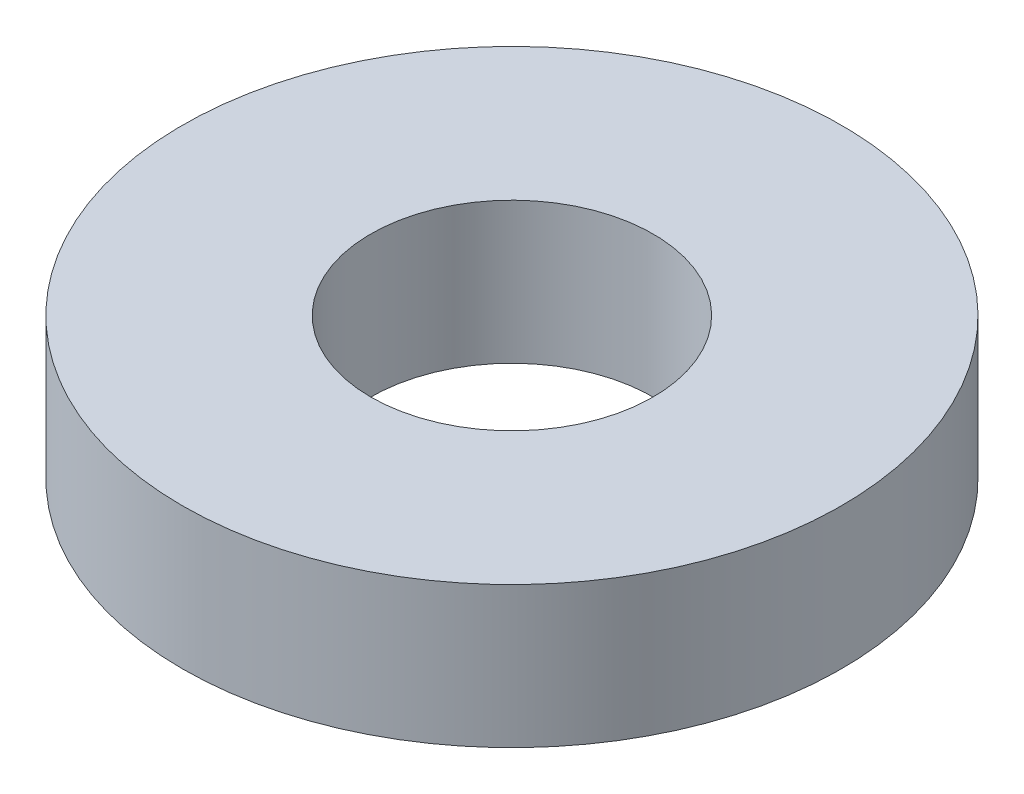
ISO-10303-21;
HEADER;
FILE_DESCRIPTION(('STEP AP214'),'2;1');
FILE_NAME('part.step','',(''),(''),'','','');
FILE_SCHEMA(('AUTOMOTIVE_DESIGN { 1 0 10303 214 1 1 1 1 }'));
ENDSEC;
DATA;
#1=APPLICATION_CONTEXT('core data for automotive mechanical design processes');
#2=APPLICATION_PROTOCOL_DEFINITION('international standard','automotive_design',2000,#1);
#3=PRODUCT_CONTEXT('',#1,'mechanical');
#4=PRODUCT('Part','Part','',(#3));
#5=PRODUCT_RELATED_PRODUCT_CATEGORY('part','',(#4));
#6=PRODUCT_DEFINITION_FORMATION('','',#4);
#7=PRODUCT_DEFINITION_CONTEXT('part definition',#1,'design');
#8=PRODUCT_DEFINITION('design','',#6,#7);
#9=PRODUCT_DEFINITION_SHAPE('','',#8);
#10=(LENGTH_UNIT() NAMED_UNIT(*) SI_UNIT(.MILLI.,.METRE.));
#11=(NAMED_UNIT(*) PLANE_ANGLE_UNIT() SI_UNIT($,.RADIAN.));
#12=(NAMED_UNIT(*) SI_UNIT($,.STERADIAN.) SOLID_ANGLE_UNIT());
#13=UNCERTAINTY_MEASURE_WITH_UNIT(LENGTH_MEASURE(1.E-05),#10,'distance_accuracy_value','');
#14=(GEOMETRIC_REPRESENTATION_CONTEXT(3) GLOBAL_UNCERTAINTY_ASSIGNED_CONTEXT((#13)) GLOBAL_UNIT_ASSIGNED_CONTEXT((#10,
#11,#12)) REPRESENTATION_CONTEXT('',''));
#15=CARTESIAN_POINT('',(0.,0.,0.));
#16=DIRECTION('',(0.,0.,1.));
#17=DIRECTION('',(1.,0.,0.));
#18=AXIS2_PLACEMENT_3D('',#15,#16,#17);
#19=CARTESIAN_POINT('',(0.,3.,0.));
#20=DIRECTION('',(0.,1.,0.));
#21=DIRECTION('',(0.,0.,1.));
#22=AXIS2_PLACEMENT_3D('',#19,#20,#21);
#23=PLANE('',#22);
#24=CARTESIAN_POINT('',(0.,3.,0.));
#25=DIRECTION('',(0.,1.,0.));
#26=DIRECTION('',(0.,0.,1.));
#27=AXIS2_PLACEMENT_3D('',#24,#25,#26);
#28=CIRCLE('',#27,7.);
#29=CARTESIAN_POINT('',(0.,3.,7.));
#30=VERTEX_POINT('',#29);
#31=EDGE_CURVE('E10',#30,#30,#28,.T.);
#32=ORIENTED_EDGE('',*,*,#31,.T.);
#33=EDGE_LOOP('',(#32));
#34=FACE_BOUND('',#33,.T.);
#35=CARTESIAN_POINT('',(0.,3.,0.));
#36=DIRECTION('',(0.,1.,0.));
#37=DIRECTION('',(0.,0.,1.));
#38=AXIS2_PLACEMENT_3D('',#35,#36,#37);
#39=CIRCLE('',#38,3.);
#40=CARTESIAN_POINT('',(0.,3.,3.));
#41=VERTEX_POINT('',#40);
#42=EDGE_CURVE('E42',#41,#41,#39,.T.);
#43=ORIENTED_EDGE('',*,*,#42,.F.);
#44=EDGE_LOOP('',(#43));
#45=FACE_BOUND('',#44,.T.);
#46=ADVANCED_FACE('F31',(#34,#45),#23,.T.);
#47=CARTESIAN_POINT('',(0.,0.,0.));
#48=DIRECTION('',(0.,1.,0.));
#49=DIRECTION('',(0.,0.,1.));
#50=AXIS2_PLACEMENT_3D('',#47,#48,#49);
#51=PLANE('',#50);
#52=CARTESIAN_POINT('',(0.,0.,0.));
#53=DIRECTION('',(0.,1.,0.));
#54=DIRECTION('',(0.,0.,1.));
#55=AXIS2_PLACEMENT_3D('',#52,#53,#54);
#56=CIRCLE('',#55,7.);
#57=CARTESIAN_POINT('',(0.,0.,7.));
#58=VERTEX_POINT('',#57);
#59=EDGE_CURVE('E35',#58,#58,#56,.T.);
#60=ORIENTED_EDGE('',*,*,#59,.F.);
#61=EDGE_LOOP('',(#60));
#62=FACE_BOUND('',#61,.T.);
#63=CARTESIAN_POINT('',(0.,0.,0.));
#64=DIRECTION('',(0.,1.,0.));
#65=DIRECTION('',(0.,0.,1.));
#66=AXIS2_PLACEMENT_3D('',#63,#64,#65);
#67=CIRCLE('',#66,3.);
#68=CARTESIAN_POINT('',(0.,0.,3.));
#69=VERTEX_POINT('',#68);
#70=EDGE_CURVE('E44',#69,#69,#67,.T.);
#71=ORIENTED_EDGE('',*,*,#70,.T.);
#72=EDGE_LOOP('',(#71));
#73=FACE_BOUND('',#72,.T.);
#74=ADVANCED_FACE('F54',(#62,#73),#51,.F.);
#75=CARTESIAN_POINT('',(0.,3.,0.));
#76=DIRECTION('',(0.,-1.,0.));
#77=DIRECTION('',(0.,0.,-1.));
#78=AXIS2_PLACEMENT_3D('',#75,#76,#77);
#79=CYLINDRICAL_SURFACE('',#78,7.);
#80=ORIENTED_EDGE('',*,*,#31,.F.);
#81=EDGE_LOOP('',(#80));
#82=FACE_BOUND('',#81,.T.);
#83=ORIENTED_EDGE('',*,*,#59,.T.);
#84=EDGE_LOOP('',(#83));
#85=FACE_BOUND('',#84,.T.);
#86=ADVANCED_FACE('F33',(#82,#85),#79,.T.);
#87=CARTESIAN_POINT('',(0.,3.,0.));
#88=DIRECTION('',(0.,-1.,0.));
#89=DIRECTION('',(0.,0.,-1.));
#90=AXIS2_PLACEMENT_3D('',#87,#88,#89);
#91=CYLINDRICAL_SURFACE('',#90,3.);
#92=ORIENTED_EDGE('',*,*,#42,.T.);
#93=EDGE_LOOP('',(#92));
#94=FACE_BOUND('',#93,.T.);
#95=ORIENTED_EDGE('',*,*,#70,.F.);
#96=EDGE_LOOP('',(#95));
#97=FACE_BOUND('',#96,.T.);
#98=ADVANCED_FACE('F50',(#94,#97),#91,.F.);
#99=CLOSED_SHELL('',(#46,#74,#86,#98));
#100=MANIFOLD_SOLID_BREP('B2',#99);
#101=ADVANCED_BREP_SHAPE_REPRESENTATION('',(#18,#100),#14);
#102=SHAPE_DEFINITION_REPRESENTATION(#9,#101);
ENDSEC;
END-ISO-10303-21;
